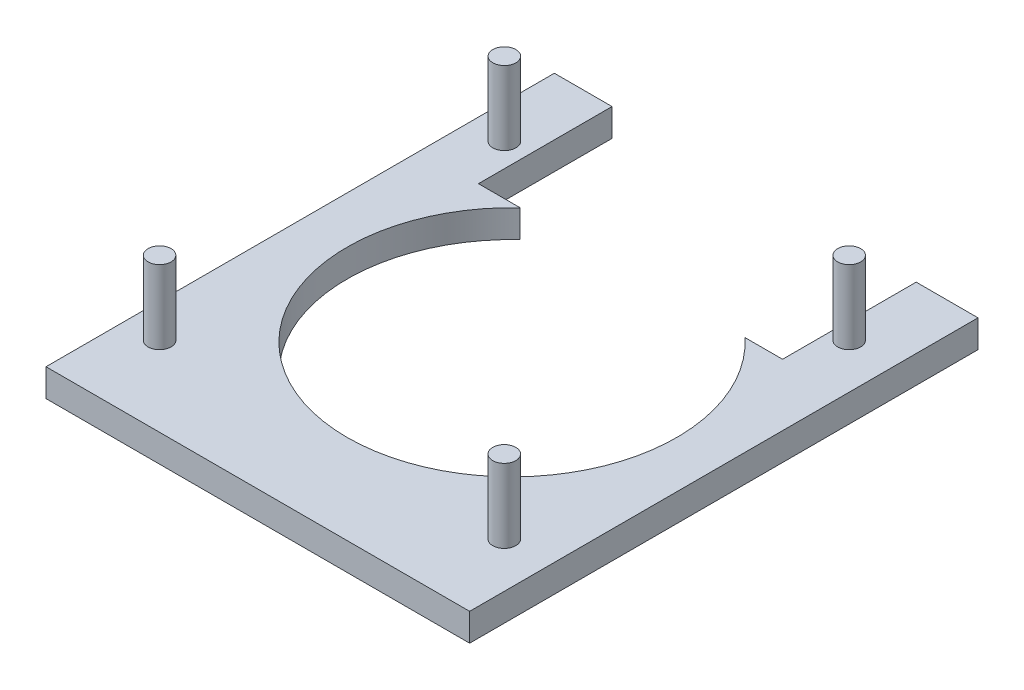
ISO-10303-21;
HEADER;
FILE_DESCRIPTION(('STEP AP214'),'2;1');
FILE_NAME('part.step','',(''),(''),'','','');
FILE_SCHEMA(('AUTOMOTIVE_DESIGN { 1 0 10303 214 1 1 1 1 }'));
ENDSEC;
DATA;
#1=APPLICATION_CONTEXT('core data for automotive mechanical design processes');
#2=APPLICATION_PROTOCOL_DEFINITION('international standard','automotive_design',2000,#1);
#3=PRODUCT_CONTEXT('',#1,'mechanical');
#4=PRODUCT('Part','Part','',(#3));
#5=PRODUCT_RELATED_PRODUCT_CATEGORY('part','',(#4));
#6=PRODUCT_DEFINITION_FORMATION('','',#4);
#7=PRODUCT_DEFINITION_CONTEXT('part definition',#1,'design');
#8=PRODUCT_DEFINITION('design','',#6,#7);
#9=PRODUCT_DEFINITION_SHAPE('','',#8);
#10=(LENGTH_UNIT() NAMED_UNIT(*) SI_UNIT(.MILLI.,.METRE.));
#11=(NAMED_UNIT(*) PLANE_ANGLE_UNIT() SI_UNIT($,.RADIAN.));
#12=(NAMED_UNIT(*) SI_UNIT($,.STERADIAN.) SOLID_ANGLE_UNIT());
#13=UNCERTAINTY_MEASURE_WITH_UNIT(LENGTH_MEASURE(1.E-05),#10,'distance_accuracy_value','');
#14=(GEOMETRIC_REPRESENTATION_CONTEXT(3) GLOBAL_UNCERTAINTY_ASSIGNED_CONTEXT((#13)) GLOBAL_UNIT_ASSIGNED_CONTEXT((#10,
#11,#12)) REPRESENTATION_CONTEXT('',''));
#15=CARTESIAN_POINT('',(0.,0.,0.));
#16=DIRECTION('',(0.,0.,1.));
#17=DIRECTION('',(1.,0.,0.));
#18=AXIS2_PLACEMENT_3D('',#15,#16,#17);
#19=CARTESIAN_POINT('',(-16.735815957187,-5.,-13.0921322117871));
#20=DIRECTION('',(0.,0.,1.));
#21=DIRECTION('',(1.,0.,0.));
#22=AXIS2_PLACEMENT_3D('',#19,#20,#21);
#23=PLANE('',#22);
#24=DIRECTION('',(-1.,0.,0.));
#25=VECTOR('',#24,1.);
#26=CARTESIAN_POINT('',(0.,0.,-13.0921322117871));
#27=LINE('',#26,#25);
#28=CARTESIAN_POINT('',(16.2875351726194,0.,-13.0921322117871));
#29=VERTEX_POINT('',#28);
#30=CARTESIAN_POINT('',(12.2068044200392,0.,-13.0921322117871));
#31=VERTEX_POINT('',#30);
#32=EDGE_CURVE('E134',#29,#31,#27,.T.);
#33=ORIENTED_EDGE('',*,*,#32,.T.);
#34=DIRECTION('',(0.,1.,0.));
#35=VECTOR('',#34,1.);
#36=CARTESIAN_POINT('',(12.2068044200392,-5.,-13.0921322117871));
#37=LINE('',#36,#35);
#38=CARTESIAN_POINT('',(12.2068044200392,3.,-13.0921322117871));
#39=VERTEX_POINT('',#38);
#40=EDGE_CURVE('E120',#31,#39,#37,.T.);
#41=ORIENTED_EDGE('',*,*,#40,.T.);
#42=DIRECTION('',(1.,0.,0.));
#43=VECTOR('',#42,1.);
#44=CARTESIAN_POINT('',(-16.735815957187,3.,-13.0921322117871));
#45=LINE('',#44,#43);
#46=CARTESIAN_POINT('',(16.2875351726194,3.,-13.0921322117871));
#47=VERTEX_POINT('',#46);
#48=EDGE_CURVE('E131',#39,#47,#45,.T.);
#49=ORIENTED_EDGE('',*,*,#48,.T.);
#50=DIRECTION('',(0.,1.,0.));
#51=VECTOR('',#50,1.);
#52=CARTESIAN_POINT('',(16.2875351726194,-5.,-13.0921322117871));
#53=LINE('',#52,#51);
#54=EDGE_CURVE('E149',#29,#47,#53,.T.);
#55=ORIENTED_EDGE('',*,*,#54,.F.);
#56=EDGE_LOOP('',(#33,#41,#49,#55));
#57=FACE_BOUND('',#56,.T.);
#58=ADVANCED_FACE('F42',(#57),#23,.F.);
#59=CARTESIAN_POINT('',(-23.,3.,-27.6));
#60=DIRECTION('',(0.,0.,1.));
#61=DIRECTION('',(1.,0.,0.));
#62=AXIS2_PLACEMENT_3D('',#59,#60,#61);
#63=PLANE('',#62);
#64=DIRECTION('',(0.,-1.,0.));
#65=VECTOR('',#64,1.);
#66=CARTESIAN_POINT('',(16.2875351726194,3.,-27.6));
#67=LINE('',#66,#65);
#68=CARTESIAN_POINT('',(16.2875351726194,3.,-27.6));
#69=VERTEX_POINT('',#68);
#70=CARTESIAN_POINT('',(16.2875351726194,0.,-27.6));
#71=VERTEX_POINT('',#70);
#72=EDGE_CURVE('E65',#69,#71,#67,.T.);
#73=ORIENTED_EDGE('',*,*,#72,.F.);
#74=DIRECTION('',(-1.,0.,0.));
#75=VECTOR('',#74,1.);
#76=CARTESIAN_POINT('',(-23.,3.,-27.6));
#77=LINE('',#76,#75);
#78=CARTESIAN_POINT('',(23.,3.,-27.6));
#79=VERTEX_POINT('',#78);
#80=EDGE_CURVE('E163',#79,#69,#77,.T.);
#81=ORIENTED_EDGE('',*,*,#80,.F.);
#82=DIRECTION('',(0.,-1.,0.));
#83=VECTOR('',#82,1.);
#84=CARTESIAN_POINT('',(23.,3.,-27.6));
#85=LINE('',#84,#83);
#86=CARTESIAN_POINT('',(23.,0.,-27.6));
#87=VERTEX_POINT('',#86);
#88=EDGE_CURVE('E187',#79,#87,#85,.T.);
#89=ORIENTED_EDGE('',*,*,#88,.T.);
#90=DIRECTION('',(-1.,0.,0.));
#91=VECTOR('',#90,1.);
#92=CARTESIAN_POINT('',(-23.,0.,-27.6));
#93=LINE('',#92,#91);
#94=EDGE_CURVE('E173',#87,#71,#93,.T.);
#95=ORIENTED_EDGE('',*,*,#94,.T.);
#96=EDGE_LOOP('',(#73,#81,#89,#95));
#97=FACE_BOUND('',#96,.T.);
#98=ADVANCED_FACE('F232',(#97),#63,.F.);
#99=CARTESIAN_POINT('',(23.,3.,27.6));
#100=DIRECTION('',(-1.,0.,0.));
#101=DIRECTION('',(0.,0.,1.));
#102=AXIS2_PLACEMENT_3D('',#99,#100,#101);
#103=PLANE('',#102);
#104=DIRECTION('',(0.,0.,-1.));
#105=VECTOR('',#104,1.);
#106=CARTESIAN_POINT('',(23.,0.,27.6));
#107=LINE('',#106,#105);
#108=CARTESIAN_POINT('',(23.,0.,27.6));
#109=VERTEX_POINT('',#108);
#110=EDGE_CURVE('E157',#109,#87,#107,.T.);
#111=ORIENTED_EDGE('',*,*,#110,.T.);
#112=ORIENTED_EDGE('',*,*,#88,.F.);
#113=DIRECTION('',(0.,0.,-1.));
#114=VECTOR('',#113,1.);
#115=CARTESIAN_POINT('',(23.,3.,27.6));
#116=LINE('',#115,#114);
#117=CARTESIAN_POINT('',(23.,3.,27.6));
#118=VERTEX_POINT('',#117);
#119=EDGE_CURVE('E158',#118,#79,#116,.T.);
#120=ORIENTED_EDGE('',*,*,#119,.F.);
#121=DIRECTION('',(0.,-1.,0.));
#122=VECTOR('',#121,1.);
#123=CARTESIAN_POINT('',(23.,3.,27.6));
#124=LINE('',#123,#122);
#125=EDGE_CURVE('E169',#118,#109,#124,.T.);
#126=ORIENTED_EDGE('',*,*,#125,.T.);
#127=EDGE_LOOP('',(#111,#112,#120,#126));
#128=FACE_BOUND('',#127,.T.);
#129=ADVANCED_FACE('F44',(#128),#103,.F.);
#130=CARTESIAN_POINT('',(-16.735815957187,3.,-27.6));
#131=VERTEX_POINT('',#130);
#132=CARTESIAN_POINT('',(-23.,3.,-27.6));
#133=VERTEX_POINT('',#132);
#134=EDGE_CURVE('E161',#131,#133,#77,.T.);
#135=ORIENTED_EDGE('',*,*,#134,.F.);
#136=DIRECTION('',(0.,-1.,0.));
#137=VECTOR('',#136,1.);
#138=CARTESIAN_POINT('',(-16.735815957187,3.,-27.6));
#139=LINE('',#138,#137);
#140=CARTESIAN_POINT('',(-16.735815957187,0.,-27.6));
#141=VERTEX_POINT('',#140);
#142=EDGE_CURVE('E154',#131,#141,#139,.T.);
#143=ORIENTED_EDGE('',*,*,#142,.T.);
#144=CARTESIAN_POINT('',(-23.,0.,-27.6));
#145=VERTEX_POINT('',#144);
#146=EDGE_CURVE('E172',#141,#145,#93,.T.);
#147=ORIENTED_EDGE('',*,*,#146,.T.);
#148=DIRECTION('',(0.,-1.,0.));
#149=VECTOR('',#148,1.);
#150=CARTESIAN_POINT('',(-23.,3.,-27.6));
#151=LINE('',#150,#149);
#152=EDGE_CURVE('E184',#133,#145,#151,.T.);
#153=ORIENTED_EDGE('',*,*,#152,.F.);
#154=EDGE_LOOP('',(#135,#143,#147,#153));
#155=FACE_BOUND('',#154,.T.);
#156=ADVANCED_FACE('F240',(#155),#63,.F.);
#157=CARTESIAN_POINT('',(-23.,3.,27.6));
#158=DIRECTION('',(1.,0.,0.));
#159=DIRECTION('',(0.,0.,-1.));
#160=AXIS2_PLACEMENT_3D('',#157,#158,#159);
#161=PLANE('',#160);
#162=DIRECTION('',(0.,0.,1.));
#163=VECTOR('',#162,1.);
#164=CARTESIAN_POINT('',(-23.,0.,27.6));
#165=LINE('',#164,#163);
#166=CARTESIAN_POINT('',(-23.,0.,27.6));
#167=VERTEX_POINT('',#166);
#168=EDGE_CURVE('E176',#145,#167,#165,.T.);
#169=ORIENTED_EDGE('',*,*,#168,.T.);
#170=DIRECTION('',(0.,-1.,0.));
#171=VECTOR('',#170,1.);
#172=CARTESIAN_POINT('',(-23.,3.,27.6));
#173=LINE('',#172,#171);
#174=CARTESIAN_POINT('',(-23.,3.,27.6));
#175=VERTEX_POINT('',#174);
#176=EDGE_CURVE('E181',#175,#167,#173,.T.);
#177=ORIENTED_EDGE('',*,*,#176,.F.);
#178=DIRECTION('',(0.,0.,1.));
#179=VECTOR('',#178,1.);
#180=CARTESIAN_POINT('',(-23.,3.,27.6));
#181=LINE('',#180,#179);
#182=EDGE_CURVE('E165',#133,#175,#181,.T.);
#183=ORIENTED_EDGE('',*,*,#182,.F.);
#184=ORIENTED_EDGE('',*,*,#152,.T.);
#185=EDGE_LOOP('',(#169,#177,#183,#184));
#186=FACE_BOUND('',#185,.T.);
#187=ADVANCED_FACE('F260',(#186),#161,.F.);
#188=CARTESIAN_POINT('',(-23.,3.,27.6));
#189=DIRECTION('',(0.,0.,-1.));
#190=DIRECTION('',(-1.,0.,0.));
#191=AXIS2_PLACEMENT_3D('',#188,#189,#190);
#192=PLANE('',#191);
#193=DIRECTION('',(1.,0.,0.));
#194=VECTOR('',#193,1.);
#195=CARTESIAN_POINT('',(-23.,0.,27.6));
#196=LINE('',#195,#194);
#197=EDGE_CURVE('E162',#167,#109,#196,.T.);
#198=ORIENTED_EDGE('',*,*,#197,.T.);
#199=ORIENTED_EDGE('',*,*,#125,.F.);
#200=DIRECTION('',(1.,0.,0.));
#201=VECTOR('',#200,1.);
#202=CARTESIAN_POINT('',(-23.,3.,27.6));
#203=LINE('',#202,#201);
#204=EDGE_CURVE('E167',#175,#118,#203,.T.);
#205=ORIENTED_EDGE('',*,*,#204,.F.);
#206=ORIENTED_EDGE('',*,*,#176,.T.);
#207=EDGE_LOOP('',(#198,#199,#205,#206));
#208=FACE_BOUND('',#207,.T.);
#209=ADVANCED_FACE('F209',(#208),#192,.F.);
#210=CARTESIAN_POINT('',(0.,3.,0.));
#211=DIRECTION('',(0.,-1.,0.));
#212=DIRECTION('',(0.,0.,-1.));
#213=AXIS2_PLACEMENT_3D('',#210,#211,#212);
#214=PLANE('',#213);
#215=CARTESIAN_POINT('',(18.1220867237042,3.,-18.489975820906));
#216=DIRECTION('',(0.,-1.,0.));
#217=DIRECTION('',(0.,0.,-1.));
#218=AXIS2_PLACEMENT_3D('',#215,#216,#217);
#219=CIRCLE('',#218,1.25);
#220=CARTESIAN_POINT('',(18.1220867237042,3.,-19.739975820906));
#221=VERTEX_POINT('',#220);
#222=EDGE_CURVE('E11',#221,#221,#219,.F.);
#223=ORIENTED_EDGE('',*,*,#222,.F.);
#224=EDGE_LOOP('',(#223));
#225=FACE_BOUND('',#224,.T.);
#226=CARTESIAN_POINT('',(-19.3179132762958,3.,18.950024179094));
#227=DIRECTION('',(0.,-1.,0.));
#228=DIRECTION('',(0.,0.,-1.));
#229=AXIS2_PLACEMENT_3D('',#226,#227,#228);
#230=CIRCLE('',#229,1.25);
#231=CARTESIAN_POINT('',(-19.3179132762958,3.,17.700024179094));
#232=VERTEX_POINT('',#231);
#233=EDGE_CURVE('E50',#232,#232,#230,.F.);
#234=ORIENTED_EDGE('',*,*,#233,.F.);
#235=EDGE_LOOP('',(#234));
#236=FACE_BOUND('',#235,.T.);
#237=CARTESIAN_POINT('',(18.084134894165,3.,18.9244646018641));
#238=DIRECTION('',(0.,-1.,0.));
#239=DIRECTION('',(0.,0.,-1.));
#240=AXIS2_PLACEMENT_3D('',#237,#238,#239);
#241=CIRCLE('',#240,1.25);
#242=CARTESIAN_POINT('',(18.084134894165,3.,17.6744646018641));
#243=VERTEX_POINT('',#242);
#244=EDGE_CURVE('E199',#243,#243,#241,.F.);
#245=ORIENTED_EDGE('',*,*,#244,.F.);
#246=EDGE_LOOP('',(#245));
#247=FACE_BOUND('',#246,.T.);
#248=CARTESIAN_POINT('',(-19.3179132762958,3.,-18.489975820906));
#249=DIRECTION('',(0.,-1.,0.));
#250=DIRECTION('',(0.,0.,-1.));
#251=AXIS2_PLACEMENT_3D('',#248,#249,#250);
#252=CIRCLE('',#251,1.25);
#253=CARTESIAN_POINT('',(-19.3179132762958,3.,-19.739975820906));
#254=VERTEX_POINT('',#253);
#255=EDGE_CURVE('E135',#254,#254,#252,.F.);
#256=ORIENTED_EDGE('',*,*,#255,.F.);
#257=EDGE_LOOP('',(#256));
#258=FACE_BOUND('',#257,.T.);
#259=ORIENTED_EDGE('',*,*,#48,.F.);
#260=CARTESIAN_POINT('',(0.,3.,0.));
#261=DIRECTION('',(0.,1.,0.));
#262=DIRECTION('',(0.,0.,1.));
#263=AXIS2_PLACEMENT_3D('',#260,#261,#262);
#264=CIRCLE('',#263,17.9);
#265=CARTESIAN_POINT('',(-12.2068044200392,3.,-13.0921322117871));
#266=VERTEX_POINT('',#265);
#267=EDGE_CURVE('E117',#266,#39,#264,.T.);
#268=ORIENTED_EDGE('',*,*,#267,.F.);
#269=CARTESIAN_POINT('',(-16.735815957187,3.,-13.0921322117871));
#270=VERTEX_POINT('',#269);
#271=EDGE_CURVE('E141',#270,#266,#45,.T.);
#272=ORIENTED_EDGE('',*,*,#271,.F.);
#273=DIRECTION('',(0.,0.,1.));
#274=VECTOR('',#273,1.);
#275=CARTESIAN_POINT('',(-16.735815957187,3.,-33.9202856186108));
#276=LINE('',#275,#274);
#277=EDGE_CURVE('E146',#131,#270,#276,.T.);
#278=ORIENTED_EDGE('',*,*,#277,.F.);
#279=ORIENTED_EDGE('',*,*,#134,.T.);
#280=ORIENTED_EDGE('',*,*,#182,.T.);
#281=ORIENTED_EDGE('',*,*,#204,.T.);
#282=ORIENTED_EDGE('',*,*,#119,.T.);
#283=ORIENTED_EDGE('',*,*,#80,.T.);
#284=DIRECTION('',(0.,0.,1.));
#285=VECTOR('',#284,1.);
#286=CARTESIAN_POINT('',(16.2875351726194,3.,-33.9202856186108));
#287=LINE('',#286,#285);
#288=EDGE_CURVE('E140',#69,#47,#287,.T.);
#289=ORIENTED_EDGE('',*,*,#288,.T.);
#290=EDGE_LOOP('',(#259,#268,#272,#278,#279,#280,#281,#282,#283,#289));
#291=FACE_BOUND('',#290,.T.);
#292=ADVANCED_FACE('F138',(#225,#236,#247,#258,#291),#214,.F.);
#293=CARTESIAN_POINT('',(0.,0.,0.));
#294=DIRECTION('',(0.,-1.,0.));
#295=DIRECTION('',(0.,0.,-1.));
#296=AXIS2_PLACEMENT_3D('',#293,#294,#295);
#297=PLANE('',#296);
#298=CARTESIAN_POINT('',(0.,0.,0.));
#299=DIRECTION('',(0.,-1.,0.));
#300=DIRECTION('',(0.,0.,-1.));
#301=AXIS2_PLACEMENT_3D('',#298,#299,#300);
#302=CIRCLE('',#301,17.9);
#303=CARTESIAN_POINT('',(-12.2068044200392,0.,-13.0921322117871));
#304=VERTEX_POINT('',#303);
#305=EDGE_CURVE('E57',#31,#304,#302,.T.);
#306=ORIENTED_EDGE('',*,*,#305,.F.);
#307=ORIENTED_EDGE('',*,*,#32,.F.);
#308=DIRECTION('',(0.,0.,-1.));
#309=VECTOR('',#308,1.);
#310=CARTESIAN_POINT('',(16.2875351726194,0.,0.));
#311=LINE('',#310,#309);
#312=EDGE_CURVE('E190',#29,#71,#311,.T.);
#313=ORIENTED_EDGE('',*,*,#312,.T.);
#314=ORIENTED_EDGE('',*,*,#94,.F.);
#315=ORIENTED_EDGE('',*,*,#110,.F.);
#316=ORIENTED_EDGE('',*,*,#197,.F.);
#317=ORIENTED_EDGE('',*,*,#168,.F.);
#318=ORIENTED_EDGE('',*,*,#146,.F.);
#319=DIRECTION('',(0.,0.,-1.));
#320=VECTOR('',#319,1.);
#321=CARTESIAN_POINT('',(-16.735815957187,0.,0.));
#322=LINE('',#321,#320);
#323=CARTESIAN_POINT('',(-16.735815957187,0.,-13.0921322117871));
#324=VERTEX_POINT('',#323);
#325=EDGE_CURVE('E194',#324,#141,#322,.T.);
#326=ORIENTED_EDGE('',*,*,#325,.F.);
#327=EDGE_CURVE('E192',#304,#324,#27,.T.);
#328=ORIENTED_EDGE('',*,*,#327,.F.);
#329=EDGE_LOOP('',(#306,#307,#313,#314,#315,#316,#317,#318,#326,#328));
#330=FACE_BOUND('',#329,.T.);
#331=ADVANCED_FACE('F208',(#330),#297,.T.);
#332=CARTESIAN_POINT('',(-16.735815957187,-5.,-33.9202856186108));
#333=DIRECTION('',(-1.,0.,0.));
#334=DIRECTION('',(0.,0.,1.));
#335=AXIS2_PLACEMENT_3D('',#332,#333,#334);
#336=PLANE('',#335);
#337=ORIENTED_EDGE('',*,*,#277,.T.);
#338=DIRECTION('',(0.,1.,0.));
#339=VECTOR('',#338,1.);
#340=CARTESIAN_POINT('',(-16.735815957187,-5.,-13.0921322117871));
#341=LINE('',#340,#339);
#342=EDGE_CURVE('E150',#324,#270,#341,.T.);
#343=ORIENTED_EDGE('',*,*,#342,.F.);
#344=ORIENTED_EDGE('',*,*,#325,.T.);
#345=ORIENTED_EDGE('',*,*,#142,.F.);
#346=EDGE_LOOP('',(#337,#343,#344,#345));
#347=FACE_BOUND('',#346,.T.);
#348=ADVANCED_FACE('F247',(#347),#336,.F.);
#349=CARTESIAN_POINT('',(16.2875351726194,-5.,-33.9202856186108));
#350=DIRECTION('',(-1.,0.,0.));
#351=DIRECTION('',(0.,0.,1.));
#352=AXIS2_PLACEMENT_3D('',#349,#350,#351);
#353=PLANE('',#352);
#354=ORIENTED_EDGE('',*,*,#72,.T.);
#355=ORIENTED_EDGE('',*,*,#312,.F.);
#356=ORIENTED_EDGE('',*,*,#54,.T.);
#357=ORIENTED_EDGE('',*,*,#288,.F.);
#358=EDGE_LOOP('',(#354,#355,#356,#357));
#359=FACE_BOUND('',#358,.T.);
#360=ADVANCED_FACE('F243',(#359),#353,.T.);
#361=ORIENTED_EDGE('',*,*,#271,.T.);
#362=DIRECTION('',(0.,1.,0.));
#363=VECTOR('',#362,1.);
#364=CARTESIAN_POINT('',(-12.2068044200392,-5.,-13.0921322117871));
#365=LINE('',#364,#363);
#366=EDGE_CURVE('E121',#266,#304,#365,.F.);
#367=ORIENTED_EDGE('',*,*,#366,.T.);
#368=ORIENTED_EDGE('',*,*,#327,.T.);
#369=ORIENTED_EDGE('',*,*,#342,.T.);
#370=EDGE_LOOP('',(#361,#367,#368,#369));
#371=FACE_BOUND('',#370,.T.);
#372=ADVANCED_FACE('F228',(#371),#23,.F.);
#373=CARTESIAN_POINT('',(0.,-5.,0.));
#374=DIRECTION('',(0.,1.,0.));
#375=DIRECTION('',(0.,0.,1.));
#376=AXIS2_PLACEMENT_3D('',#373,#374,#375);
#377=CYLINDRICAL_SURFACE('',#376,17.9);
#378=ORIENTED_EDGE('',*,*,#305,.T.);
#379=ORIENTED_EDGE('',*,*,#366,.F.);
#380=ORIENTED_EDGE('',*,*,#267,.T.);
#381=ORIENTED_EDGE('',*,*,#40,.F.);
#382=EDGE_LOOP('',(#378,#379,#380,#381));
#383=FACE_BOUND('',#382,.T.);
#384=ADVANCED_FACE('F119',(#383),#377,.F.);
#385=CARTESIAN_POINT('',(-19.3179132762958,11.,-18.489975820906));
#386=DIRECTION('',(0.,-1.,0.));
#387=DIRECTION('',(0.,0.,-1.));
#388=AXIS2_PLACEMENT_3D('',#385,#386,#387);
#389=CYLINDRICAL_SURFACE('',#388,1.25);
#390=CARTESIAN_POINT('',(-19.3179132762958,11.,-18.489975820906));
#391=DIRECTION('',(0.,1.,0.));
#392=DIRECTION('',(0.,0.,1.));
#393=AXIS2_PLACEMENT_3D('',#390,#391,#392);
#394=CIRCLE('',#393,1.25);
#395=CARTESIAN_POINT('',(-19.3179132762958,11.,-17.239975820906));
#396=VERTEX_POINT('',#395);
#397=EDGE_CURVE('E126',#396,#396,#394,.T.);
#398=ORIENTED_EDGE('',*,*,#397,.F.);
#399=EDGE_LOOP('',(#398));
#400=FACE_BOUND('',#399,.T.);
#401=ORIENTED_EDGE('',*,*,#255,.T.);
#402=EDGE_LOOP('',(#401));
#403=FACE_BOUND('',#402,.T.);
#404=ADVANCED_FACE('F216',(#400,#403),#389,.T.);
#405=CARTESIAN_POINT('',(-19.3179132762958,11.,-18.489975820906));
#406=DIRECTION('',(0.,1.,0.));
#407=DIRECTION('',(0.,0.,1.));
#408=AXIS2_PLACEMENT_3D('',#405,#406,#407);
#409=PLANE('',#408);
#410=ORIENTED_EDGE('',*,*,#397,.T.);
#411=EDGE_LOOP('',(#410));
#412=FACE_BOUND('',#411,.T.);
#413=ADVANCED_FACE('F218',(#412),#409,.T.);
#414=CARTESIAN_POINT('',(18.084134894165,11.,18.9244646018641));
#415=DIRECTION('',(0.,-1.,0.));
#416=DIRECTION('',(0.,0.,-1.));
#417=AXIS2_PLACEMENT_3D('',#414,#415,#416);
#418=CYLINDRICAL_SURFACE('',#417,1.25);
#419=CARTESIAN_POINT('',(18.084134894165,11.,18.9244646018641));
#420=DIRECTION('',(0.,1.,0.));
#421=DIRECTION('',(0.,0.,1.));
#422=AXIS2_PLACEMENT_3D('',#419,#420,#421);
#423=CIRCLE('',#422,1.25);
#424=CARTESIAN_POINT('',(18.084134894165,11.,20.1744646018641));
#425=VERTEX_POINT('',#424);
#426=EDGE_CURVE('E409',#425,#425,#423,.T.);
#427=ORIENTED_EDGE('',*,*,#426,.F.);
#428=EDGE_LOOP('',(#427));
#429=FACE_BOUND('',#428,.T.);
#430=ORIENTED_EDGE('',*,*,#244,.T.);
#431=EDGE_LOOP('',(#430));
#432=FACE_BOUND('',#431,.T.);
#433=ADVANCED_FACE('F224',(#429,#432),#418,.T.);
#434=CARTESIAN_POINT('',(18.084134894165,11.,18.9244646018641));
#435=DIRECTION('',(0.,1.,0.));
#436=DIRECTION('',(0.,0.,1.));
#437=AXIS2_PLACEMENT_3D('',#434,#435,#436);
#438=PLANE('',#437);
#439=ORIENTED_EDGE('',*,*,#426,.T.);
#440=EDGE_LOOP('',(#439));
#441=FACE_BOUND('',#440,.T.);
#442=ADVANCED_FACE('F347',(#441),#438,.T.);
#443=CARTESIAN_POINT('',(-19.3179132762958,11.,18.950024179094));
#444=DIRECTION('',(0.,-1.,0.));
#445=DIRECTION('',(0.,0.,-1.));
#446=AXIS2_PLACEMENT_3D('',#443,#444,#445);
#447=CYLINDRICAL_SURFACE('',#446,1.25);
#448=CARTESIAN_POINT('',(-19.3179132762958,11.,18.950024179094));
#449=DIRECTION('',(0.,1.,0.));
#450=DIRECTION('',(0.,0.,1.));
#451=AXIS2_PLACEMENT_3D('',#448,#449,#450);
#452=CIRCLE('',#451,1.25);
#453=CARTESIAN_POINT('',(-19.3179132762958,11.,20.200024179094));
#454=VERTEX_POINT('',#453);
#455=EDGE_CURVE('E404',#454,#454,#452,.T.);
#456=ORIENTED_EDGE('',*,*,#455,.F.);
#457=EDGE_LOOP('',(#456));
#458=FACE_BOUND('',#457,.T.);
#459=ORIENTED_EDGE('',*,*,#233,.T.);
#460=EDGE_LOOP('',(#459));
#461=FACE_BOUND('',#460,.T.);
#462=ADVANCED_FACE('F204',(#458,#461),#447,.T.);
#463=CARTESIAN_POINT('',(-19.3179132762958,11.,18.950024179094));
#464=DIRECTION('',(0.,1.,0.));
#465=DIRECTION('',(0.,0.,1.));
#466=AXIS2_PLACEMENT_3D('',#463,#464,#465);
#467=PLANE('',#466);
#468=ORIENTED_EDGE('',*,*,#455,.T.);
#469=EDGE_LOOP('',(#468));
#470=FACE_BOUND('',#469,.T.);
#471=ADVANCED_FACE('F364',(#470),#467,.T.);
#472=CARTESIAN_POINT('',(18.1220867237042,11.,-18.489975820906));
#473=DIRECTION('',(0.,-1.,0.));
#474=DIRECTION('',(0.,0.,-1.));
#475=AXIS2_PLACEMENT_3D('',#472,#473,#474);
#476=CYLINDRICAL_SURFACE('',#475,1.25);
#477=CARTESIAN_POINT('',(18.1220867237042,11.,-18.489975820906));
#478=DIRECTION('',(0.,1.,0.));
#479=DIRECTION('',(0.,0.,1.));
#480=AXIS2_PLACEMENT_3D('',#477,#478,#479);
#481=CIRCLE('',#480,1.25);
#482=CARTESIAN_POINT('',(18.1220867237042,11.,-17.239975820906));
#483=VERTEX_POINT('',#482);
#484=EDGE_CURVE('E403',#483,#483,#481,.T.);
#485=ORIENTED_EDGE('',*,*,#484,.F.);
#486=EDGE_LOOP('',(#485));
#487=FACE_BOUND('',#486,.T.);
#488=ORIENTED_EDGE('',*,*,#222,.T.);
#489=EDGE_LOOP('',(#488));
#490=FACE_BOUND('',#489,.T.);
#491=ADVANCED_FACE('F373',(#487,#490),#476,.T.);
#492=CARTESIAN_POINT('',(18.1220867237042,11.,-18.489975820906));
#493=DIRECTION('',(0.,1.,0.));
#494=DIRECTION('',(0.,0.,1.));
#495=AXIS2_PLACEMENT_3D('',#492,#493,#494);
#496=PLANE('',#495);
#497=ORIENTED_EDGE('',*,*,#484,.T.);
#498=EDGE_LOOP('',(#497));
#499=FACE_BOUND('',#498,.T.);
#500=ADVANCED_FACE('F382',(#499),#496,.T.);
#501=CLOSED_SHELL('',(#58,#98,#129,#156,#187,#209,#292,#331,#348,#360,#372,#384,#404,#413,#433,
#442,#462,#471,#491,#500));
#502=MANIFOLD_SOLID_BREP('B2',#501);
#503=ADVANCED_BREP_SHAPE_REPRESENTATION('',(#18,#502),#14);
#504=SHAPE_DEFINITION_REPRESENTATION(#9,#503);
ENDSEC;
END-ISO-10303-21;
